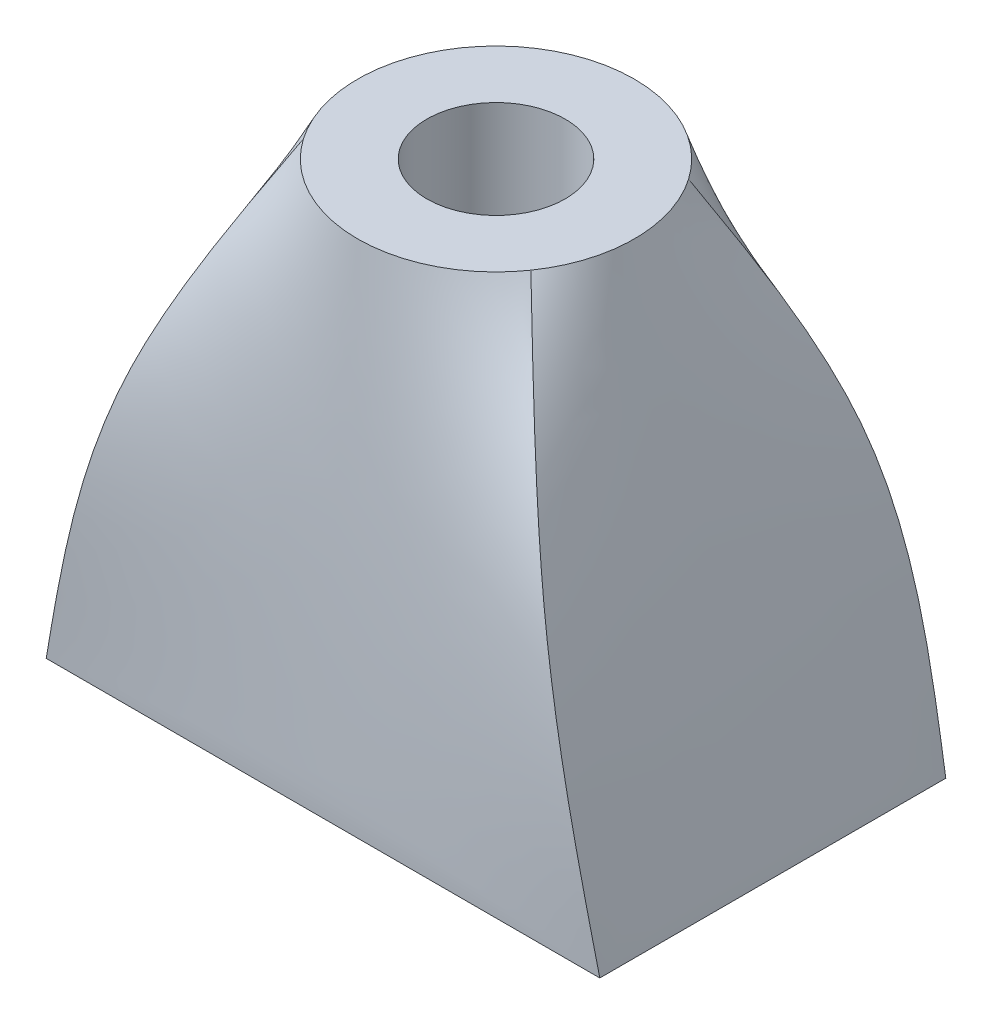
ISO-10303-21;
HEADER;
FILE_DESCRIPTION(('STEP AP214'),'2;1');
FILE_NAME('part.step','',(''),(''),'','','');
FILE_SCHEMA(('AUTOMOTIVE_DESIGN { 1 0 10303 214 1 1 1 1 }'));
ENDSEC;
DATA;
#1=APPLICATION_CONTEXT('core data for automotive mechanical design processes');
#2=APPLICATION_PROTOCOL_DEFINITION('international standard','automotive_design',2000,#1);
#3=PRODUCT_CONTEXT('',#1,'mechanical');
#4=PRODUCT('Part','Part','',(#3));
#5=PRODUCT_RELATED_PRODUCT_CATEGORY('part','',(#4));
#6=PRODUCT_DEFINITION_FORMATION('','',#4);
#7=PRODUCT_DEFINITION_CONTEXT('part definition',#1,'design');
#8=PRODUCT_DEFINITION('design','',#6,#7);
#9=PRODUCT_DEFINITION_SHAPE('','',#8);
#10=(LENGTH_UNIT() NAMED_UNIT(*) SI_UNIT(.MILLI.,.METRE.));
#11=(NAMED_UNIT(*) PLANE_ANGLE_UNIT() SI_UNIT($,.RADIAN.));
#12=(NAMED_UNIT(*) SI_UNIT($,.STERADIAN.) SOLID_ANGLE_UNIT());
#13=UNCERTAINTY_MEASURE_WITH_UNIT(LENGTH_MEASURE(1.E-05),#10,'distance_accuracy_value','');
#14=(GEOMETRIC_REPRESENTATION_CONTEXT(3) GLOBAL_UNCERTAINTY_ASSIGNED_CONTEXT((#13)) GLOBAL_UNIT_ASSIGNED_CONTEXT((#10,
#11,#12)) REPRESENTATION_CONTEXT('',''));
#15=CARTESIAN_POINT('',(0.,0.,0.));
#16=DIRECTION('',(0.,0.,1.));
#17=DIRECTION('',(1.,0.,0.));
#18=AXIS2_PLACEMENT_3D('',#15,#16,#17);
#19=CARTESIAN_POINT('',(0.,-14.142135623731,0.));
#20=DIRECTION('',(0.,1.,0.));
#21=DIRECTION('',(0.,0.,1.));
#22=AXIS2_PLACEMENT_3D('',#19,#20,#21);
#23=CYLINDRICAL_SURFACE('',#22,5.);
#24=CARTESIAN_POINT('',(0.,3.,0.));
#25=DIRECTION('',(0.,1.,0.));
#26=DIRECTION('',(0.,0.,1.));
#27=AXIS2_PLACEMENT_3D('',#24,#25,#26);
#28=CIRCLE('',#27,5.);
#29=CARTESIAN_POINT('',(0.,3.,5.));
#30=VERTEX_POINT('',#29);
#31=EDGE_CURVE('E302',#30,#30,#28,.F.);
#32=ORIENTED_EDGE('',*,*,#31,.T.);
#33=EDGE_LOOP('',(#32));
#34=FACE_BOUND('',#33,.T.);
#35=CARTESIAN_POINT('',(0.,19.,0.));
#36=DIRECTION('',(0.,1.,0.));
#37=DIRECTION('',(0.,0.,1.));
#38=AXIS2_PLACEMENT_3D('',#35,#36,#37);
#39=CIRCLE('',#38,5.);
#40=CARTESIAN_POINT('',(0.,19.,5.));
#41=VERTEX_POINT('',#40);
#42=EDGE_CURVE('E86',#41,#41,#39,.F.);
#43=ORIENTED_EDGE('',*,*,#42,.F.);
#44=EDGE_LOOP('',(#43));
#45=FACE_BOUND('',#44,.T.);
#46=ADVANCED_FACE('F81',(#34,#45),#23,.F.);
#47=CARTESIAN_POINT('',(0.,0.,0.));
#48=DIRECTION('',(0.,1.,0.));
#49=DIRECTION('',(0.,0.,1.));
#50=AXIS2_PLACEMENT_3D('',#47,#48,#49);
#51=PLANE('',#50);
#52=DIRECTION('',(0.,0.,-1.));
#53=VECTOR('',#52,1.);
#54=CARTESIAN_POINT('',(20.,0.,-12.5));
#55=LINE('',#54,#53);
#56=CARTESIAN_POINT('',(20.,0.,12.5));
#57=VERTEX_POINT('',#56);
#58=CARTESIAN_POINT('',(20.,0.,-12.5));
#59=VERTEX_POINT('',#58);
#60=EDGE_CURVE('E263',#57,#59,#55,.T.);
#61=ORIENTED_EDGE('',*,*,#60,.F.);
#62=DIRECTION('',(1.,0.,0.));
#63=VECTOR('',#62,1.);
#64=CARTESIAN_POINT('',(-20.,0.,12.5));
#65=LINE('',#64,#63);
#66=CARTESIAN_POINT('',(-20.,0.,12.5));
#67=VERTEX_POINT('',#66);
#68=EDGE_CURVE('E257',#67,#57,#65,.T.);
#69=ORIENTED_EDGE('',*,*,#68,.F.);
#70=DIRECTION('',(0.,0.,1.));
#71=VECTOR('',#70,1.);
#72=CARTESIAN_POINT('',(-20.,0.,-12.5));
#73=LINE('',#72,#71);
#74=CARTESIAN_POINT('',(-20.,0.,-12.5));
#75=VERTEX_POINT('',#74);
#76=EDGE_CURVE('E91',#75,#67,#73,.T.);
#77=ORIENTED_EDGE('',*,*,#76,.F.);
#78=DIRECTION('',(-1.,0.,0.));
#79=VECTOR('',#78,1.);
#80=CARTESIAN_POINT('',(-20.,0.,-12.5));
#81=LINE('',#80,#79);
#82=EDGE_CURVE('E13',#59,#75,#81,.T.);
#83=ORIENTED_EDGE('',*,*,#82,.F.);
#84=EDGE_LOOP('',(#61,#69,#77,#83));
#85=FACE_BOUND('',#84,.T.);
#86=DIRECTION('',(0.,0.,1.));
#87=VECTOR('',#86,1.);
#88=CARTESIAN_POINT('',(9.9,0.,4.9));
#89=LINE('',#88,#87);
#90=CARTESIAN_POINT('',(9.9,0.,-4.9));
#91=VERTEX_POINT('',#90);
#92=CARTESIAN_POINT('',(9.9,0.,4.9));
#93=VERTEX_POINT('',#92);
#94=EDGE_CURVE('E99',#91,#93,#89,.T.);
#95=ORIENTED_EDGE('',*,*,#94,.F.);
#96=DIRECTION('',(1.,0.,0.));
#97=VECTOR('',#96,1.);
#98=CARTESIAN_POINT('',(-9.9,0.,-4.9));
#99=LINE('',#98,#97);
#100=CARTESIAN_POINT('',(-9.9,0.,-4.9));
#101=VERTEX_POINT('',#100);
#102=EDGE_CURVE('E103',#101,#91,#99,.T.);
#103=ORIENTED_EDGE('',*,*,#102,.F.);
#104=DIRECTION('',(0.,0.,-1.));
#105=VECTOR('',#104,1.);
#106=CARTESIAN_POINT('',(-9.9,0.,4.9));
#107=LINE('',#106,#105);
#108=CARTESIAN_POINT('',(-9.9,0.,4.9));
#109=VERTEX_POINT('',#108);
#110=EDGE_CURVE('E312',#109,#101,#107,.T.);
#111=ORIENTED_EDGE('',*,*,#110,.F.);
#112=DIRECTION('',(-1.,0.,0.));
#113=VECTOR('',#112,1.);
#114=CARTESIAN_POINT('',(-9.9,0.,4.9));
#115=LINE('',#114,#113);
#116=EDGE_CURVE('E310',#93,#109,#115,.T.);
#117=ORIENTED_EDGE('',*,*,#116,.F.);
#118=EDGE_LOOP('',(#95,#103,#111,#117));
#119=FACE_BOUND('',#118,.T.);
#120=ADVANCED_FACE('F83',(#85,#119),#51,.F.);
#121=CARTESIAN_POINT('',(0.,35.,0.));
#122=DIRECTION('',(0.,1.,0.));
#123=DIRECTION('',(0.,0.,1.));
#124=AXIS2_PLACEMENT_3D('',#121,#122,#123);
#125=PLANE('',#124);
#126=CARTESIAN_POINT('',(0.,35.,0.));
#127=DIRECTION('',(0.,1.,0.));
#128=DIRECTION('',(0.,0.,1.));
#129=AXIS2_PLACEMENT_3D('',#126,#127,#128);
#130=CIRCLE('',#129,5.);
#131=CARTESIAN_POINT('',(0.,35.,5.));
#132=VERTEX_POINT('',#131);
#133=EDGE_CURVE('E295',#132,#132,#130,.T.);
#134=ORIENTED_EDGE('',*,*,#133,.F.);
#135=EDGE_LOOP('',(#134));
#136=FACE_BOUND('',#135,.T.);
#137=CARTESIAN_POINT('',(0.,35.,0.));
#138=DIRECTION('',(0.,1.,0.));
#139=DIRECTION('',(0.,0.,1.));
#140=AXIS2_PLACEMENT_3D('',#137,#138,#139);
#141=CIRCLE('',#140,10.);
#142=CARTESIAN_POINT('',(8.21738637043559,35.,5.69864556179618));
#143=VERTEX_POINT('',#142);
#144=CARTESIAN_POINT('',(8.21738637043559,35.,-5.69864556179618));
#145=VERTEX_POINT('',#144);
#146=EDGE_CURVE('E189',#143,#145,#141,.T.);
#147=ORIENTED_EDGE('',*,*,#146,.T.);
#148=CARTESIAN_POINT('',(-8.21738637043559,35.,-5.69864556179618));
#149=VERTEX_POINT('',#148);
#150=EDGE_CURVE('E193',#145,#149,#141,.T.);
#151=ORIENTED_EDGE('',*,*,#150,.T.);
#152=CARTESIAN_POINT('',(-8.2173863704356,35.,5.69864556179618));
#153=VERTEX_POINT('',#152);
#154=EDGE_CURVE('E172',#149,#153,#141,.T.);
#155=ORIENTED_EDGE('',*,*,#154,.T.);
#156=EDGE_CURVE('E169',#153,#143,#141,.T.);
#157=ORIENTED_EDGE('',*,*,#156,.T.);
#158=EDGE_LOOP('',(#147,#151,#155,#157));
#159=FACE_BOUND('',#158,.T.);
#160=ADVANCED_FACE('F205',(#136,#159),#125,.T.);
#161=CARTESIAN_POINT('',(-8.21738637043559,35.,-5.69864556179618));
#162=CARTESIAN_POINT('',(-10.6836548708764,30.0789336376883,-8.00347869681541));
#163=CARTESIAN_POINT('',(-16.2206158956905,19.0307640471616,-13.1780050044826));
#164=CARTESIAN_POINT('',(-18.6517433061727,6.78903078043243,-12.7418713632996));
#165=CARTESIAN_POINT('',(-20.,0.,-12.5));
#166=CARTESIAN_POINT('',(-7.75034082622212,35.,-6.37212027570395));
#167=CARTESIAN_POINT('',(-9.92234405449923,30.0789336376883,-8.40246541643361));
#168=CARTESIAN_POINT('',(-14.7986570831056,19.0307640471616,-12.9607452262482));
#169=CARTESIAN_POINT('',(-17.0723736681202,6.78903078043243,-12.6643661555145));
#170=CARTESIAN_POINT('',(-18.3333333333333,0.,-12.5));
#171=CARTESIAN_POINT('',(-6.66758671374989,35.,-7.5832642943872));
#172=CARTESIAN_POINT('',(-8.31164996547087,30.0789336376883,-9.1199836380098));
#173=CARTESIAN_POINT('',(-12.0026974509662,19.0307640471616,-12.5700358566533));
#174=CARTESIAN_POINT('',(-13.9307429164047,6.78903078043243,-12.5249845768344));
#175=CARTESIAN_POINT('',(-15.,0.,-12.5));
#176=CARTESIAN_POINT('',(-4.67850153963015,35.,-8.94371919099822));
#177=CARTESIAN_POINT('',(-5.67939907909928,30.0789336376883,-9.92595812402694));
#178=CARTESIAN_POINT('',(-7.92649045008441,19.0307640471616,-12.1311594994096));
#179=CARTESIAN_POINT('',(-9.26029663743338,6.78903078043244,-12.3684199170684));
#180=CARTESIAN_POINT('',(-10.,0.,-12.5));
#181=CARTESIAN_POINT('',(-2.43865268660446,35.0000000000001,-9.7990680521784));
#182=CARTESIAN_POINT('',(-2.89858823111377,30.0789336376883,-10.4326925703304));
#183=CARTESIAN_POINT('',(-3.93117863374819,19.0307640471616,-11.8552279758417));
#184=CARTESIAN_POINT('',(-4.61870888965441,6.78903078043242,-12.2699841631411));
#185=CARTESIAN_POINT('',(-5.00000000000001,0.,-12.5));
#186=CARTESIAN_POINT('',(0.,35.,-10.1004659739108));
#187=CARTESIAN_POINT('',(0.,30.0789336376883,-10.6112497835537));
#188=CARTESIAN_POINT('',(0.,19.0307640471616,-11.7579984224767));
#189=CARTESIAN_POINT('',(0.,6.78903078043243,-12.2352985126372));
#190=CARTESIAN_POINT('',(0.,0.,-12.5));
#191=CARTESIAN_POINT('',(2.43865268660446,35.0000000000001,-9.7990680521784));
#192=CARTESIAN_POINT('',(2.89858823111377,30.0789336376883,-10.4326925703304));
#193=CARTESIAN_POINT('',(3.93117863374819,19.0307640471616,-11.8552279758417));
#194=CARTESIAN_POINT('',(4.6187088896544,6.78903078043242,-12.2699841631411));
#195=CARTESIAN_POINT('',(5.,0.,-12.5));
#196=CARTESIAN_POINT('',(4.67850153963015,34.9999999999999,-8.94371919099822));
#197=CARTESIAN_POINT('',(5.67939907909928,30.0789336376883,-9.92595812402694));
#198=CARTESIAN_POINT('',(7.92649045008441,19.0307640471616,-12.1311594994096));
#199=CARTESIAN_POINT('',(9.26029663743337,6.78903078043244,-12.3684199170684));
#200=CARTESIAN_POINT('',(10.,0.,-12.5));
#201=CARTESIAN_POINT('',(6.66758671374988,35.0000000000001,-7.58326429438721));
#202=CARTESIAN_POINT('',(8.31164996547087,30.0789336376883,-9.11998363800981));
#203=CARTESIAN_POINT('',(12.0026974509662,19.0307640471616,-12.5700358566533));
#204=CARTESIAN_POINT('',(13.9307429164047,6.78903078043242,-12.5249845768344));
#205=CARTESIAN_POINT('',(15.,0.,-12.5));
#206=CARTESIAN_POINT('',(7.75034082622212,35.,-6.37212027570396));
#207=CARTESIAN_POINT('',(9.92234405449923,30.0789336376883,-8.40246541643361));
#208=CARTESIAN_POINT('',(14.7986570831056,19.0307640471616,-12.9607452262482));
#209=CARTESIAN_POINT('',(17.0723736681202,6.78903078043243,-12.6643661555145));
#210=CARTESIAN_POINT('',(18.3333333333333,0.,-12.5));
#211=CARTESIAN_POINT('',(8.21738637043559,35.,-5.69864556179618));
#212=CARTESIAN_POINT('',(10.6836548708764,30.0789336376883,-8.00347869681541));
#213=CARTESIAN_POINT('',(16.2206158956905,19.0307640471616,-13.1780050044826));
#214=CARTESIAN_POINT('',(18.6517433061727,6.78903078043243,-12.7418713632996));
#215=CARTESIAN_POINT('',(20.,0.,-12.5));
#216=B_SPLINE_SURFACE_WITH_KNOTS('',3,3,((#161,#162,#163,#164,#165),(#166,#167,#168,#169,#170),
(#171,#172,#173,#174,#175),(#176,#177,#178,#179,#180),(#181,#182,#183,#184,#185),(#186,#187,
#188,#189,#190),(#191,#192,#193,#194,#195),(#196,#197,#198,#199,#200),(#201,#202,#203,#204,
#205),(#206,#207,#208,#209,#210),(#211,#212,#213,#214,#215)),.UNSPECIFIED.,.F.,.F.,.F.,(4,1,1,1,
1,1,1,1,4),(4,1,4),(0.,0.125,0.25,0.375,0.5,0.625,0.75,0.875,1.),(0.,0.445419154909723,1.),.UNSPECIFIED.);
#217=CARTESIAN_POINT('',(8.21738637043559,35.,-5.69864556179618));
#218=CARTESIAN_POINT('',(10.6836548708764,30.0789336376883,-8.00347869681541));
#219=CARTESIAN_POINT('',(16.2206158956905,19.0307640471616,-13.1780050044826));
#220=CARTESIAN_POINT('',(18.6517433061727,6.78903078043243,-12.7418713632996));
#221=CARTESIAN_POINT('',(20.,0.,-12.5));
#222=B_SPLINE_CURVE_WITH_KNOTS('',3,(#217,#218,#219,#220,#221),.UNSPECIFIED.,.F.,.F.,(4,1,4),
(0.,0.445419154909723,1.),.UNSPECIFIED.);
#223=EDGE_CURVE('E355',#145,#59,#222,.T.);
#224=CARTESIAN_POINT('',(-8.21738637043559,35.,-5.69864556179618));
#225=CARTESIAN_POINT('',(-10.6836548708764,30.0789336376883,-8.00347869681541));
#226=CARTESIAN_POINT('',(-16.2206158956905,19.0307640471616,-13.1780050044826));
#227=CARTESIAN_POINT('',(-18.6517433061727,6.78903078043243,-12.7418713632996));
#228=CARTESIAN_POINT('',(-20.,0.,-12.5));
#229=B_SPLINE_CURVE_WITH_KNOTS('',3,(#224,#225,#226,#227,#228),.UNSPECIFIED.,.F.,.F.,(4,1,4),
(0.,0.445419154909723,1.),.UNSPECIFIED.);
#230=EDGE_CURVE('E350',#75,#149,#229,.F.);
#231=ORIENTED_EDGE('',*,*,#150,.F.);
#232=ORIENTED_EDGE('',*,*,#223,.T.);
#233=ORIENTED_EDGE('',*,*,#82,.T.);
#234=ORIENTED_EDGE('',*,*,#230,.T.);
#235=EDGE_LOOP('',(#231,#232,#233,#234));
#236=FACE_BOUND('',#235,.T.);
#237=ADVANCED_FACE('F215',(#236),#216,.T.);
#238=CARTESIAN_POINT('',(8.21738637043559,35.,-5.69864556179618));
#239=CARTESIAN_POINT('',(10.6836548708764,30.0789336376883,-8.00347869681541));
#240=CARTESIAN_POINT('',(16.2206158956905,19.0307640471616,-13.1780050044826));
#241=CARTESIAN_POINT('',(18.6517433061727,6.78903078043243,-12.7418713632996));
#242=CARTESIAN_POINT('',(20.,0.,-12.5));
#243=CARTESIAN_POINT('',(8.81144608958351,35.,-4.84201775674768));
#244=CARTESIAN_POINT('',(11.0355937539635,30.0789336376883,-6.7247483482833));
#245=CARTESIAN_POINT('',(16.0289750216164,19.0307640471616,-10.9516222282744));
#246=CARTESIAN_POINT('',(18.5833773808922,6.78903078043243,-10.607506601675));
#247=CARTESIAN_POINT('',(20.,0.,-10.4166666666667));
#248=CARTESIAN_POINT('',(9.70253566830539,35.0000000000001,-2.98904246377438));
#249=CARTESIAN_POINT('',(11.5635020785943,30.0789336376884,-4.0845134998134));
#250=CARTESIAN_POINT('',(15.7415137105054,19.0307640471616,-6.54392958904971));
#251=CARTESIAN_POINT('',(18.4808284929716,6.78903078043242,-6.35485638003777));
#252=CARTESIAN_POINT('',(20.,0.,-6.25));
#253=CARTESIAN_POINT('',(10.1480804576663,34.9999999999999,0.));
#254=CARTESIAN_POINT('',(11.8274562409096,30.0789336376882,0.));
#255=CARTESIAN_POINT('',(15.5977830549498,19.0307640471616,0.));
#256=CARTESIAN_POINT('',(18.4295540490113,6.78903078043244,0.));
#257=CARTESIAN_POINT('',(20.,0.,0.));
#258=CARTESIAN_POINT('',(9.70253566830539,35.0000000000001,2.98904246377438));
#259=CARTESIAN_POINT('',(11.5635020785943,30.0789336376883,4.0845134998134));
#260=CARTESIAN_POINT('',(15.7415137105054,19.0307640471616,6.54392958904972));
#261=CARTESIAN_POINT('',(18.4808284929716,6.78903078043242,6.35485638003778));
#262=CARTESIAN_POINT('',(20.,0.,6.25));
#263=CARTESIAN_POINT('',(8.81144608958351,35.,4.84201775674767));
#264=CARTESIAN_POINT('',(11.0355937539635,30.0789336376883,6.7247483482833));
#265=CARTESIAN_POINT('',(16.0289750216164,19.0307640471616,10.9516222282744));
#266=CARTESIAN_POINT('',(18.5833773808922,6.78903078043243,10.607506601675));
#267=CARTESIAN_POINT('',(20.,0.,10.4166666666667));
#268=CARTESIAN_POINT('',(8.21738637043559,35.,5.69864556179618));
#269=CARTESIAN_POINT('',(10.6836548708764,30.0789336376883,8.00347869681541));
#270=CARTESIAN_POINT('',(16.2206158956905,19.0307640471616,13.1780050044826));
#271=CARTESIAN_POINT('',(18.6517433061727,6.78903078043243,12.7418713632996));
#272=CARTESIAN_POINT('',(20.,0.,12.5));
#273=B_SPLINE_SURFACE_WITH_KNOTS('',3,3,((#238,#239,#240,#241,#242),(#243,#244,#245,#246,#247),
(#248,#249,#250,#251,#252),(#253,#254,#255,#256,#257),(#258,#259,#260,#261,#262),(#263,#264,
#265,#266,#267),(#268,#269,#270,#271,#272)),.UNSPECIFIED.,.F.,.F.,.F.,(4,1,1,1,4),(4,1,4),(0.,
0.25,0.5,0.75,1.),(0.,0.445419154909723,1.),.UNSPECIFIED.);
#274=CARTESIAN_POINT('',(8.21738637043559,35.,5.69864556179618));
#275=CARTESIAN_POINT('',(10.6836548708764,30.0789336376883,8.00347869681541));
#276=CARTESIAN_POINT('',(16.2206158956905,19.0307640471616,13.1780050044826));
#277=CARTESIAN_POINT('',(18.6517433061727,6.78903078043243,12.7418713632996));
#278=CARTESIAN_POINT('',(20.,0.,12.5));
#279=B_SPLINE_CURVE_WITH_KNOTS('',3,(#274,#275,#276,#277,#278),.UNSPECIFIED.,.F.,.F.,(4,1,4),
(0.,0.445419154909723,1.),.UNSPECIFIED.);
#280=EDGE_CURVE('E360',#143,#57,#279,.T.);
#281=ORIENTED_EDGE('',*,*,#146,.F.);
#282=ORIENTED_EDGE('',*,*,#280,.T.);
#283=ORIENTED_EDGE('',*,*,#60,.T.);
#284=ORIENTED_EDGE('',*,*,#223,.F.);
#285=EDGE_LOOP('',(#281,#282,#283,#284));
#286=FACE_BOUND('',#285,.T.);
#287=ADVANCED_FACE('F358',(#286),#273,.T.);
#288=CARTESIAN_POINT('',(-8.21738637043559,35.,5.69864556179618));
#289=CARTESIAN_POINT('',(-10.6836548708764,30.0789336376883,8.00347869681541));
#290=CARTESIAN_POINT('',(-16.2206158956905,19.0307640471616,13.1780050044826));
#291=CARTESIAN_POINT('',(-18.6517433061727,6.78903078043243,12.7418713632996));
#292=CARTESIAN_POINT('',(-20.,0.,12.5));
#293=CARTESIAN_POINT('',(-8.81144608958351,35.,4.84201775674767));
#294=CARTESIAN_POINT('',(-11.0355937539635,30.0789336376883,6.7247483482833));
#295=CARTESIAN_POINT('',(-16.0289750216164,19.0307640471616,10.9516222282744));
#296=CARTESIAN_POINT('',(-18.5833773808922,6.78903078043243,10.607506601675));
#297=CARTESIAN_POINT('',(-20.,0.,10.4166666666667));
#298=CARTESIAN_POINT('',(-9.70253566830538,35.0000000000001,2.98904246377438));
#299=CARTESIAN_POINT('',(-11.5635020785942,30.0789336376884,4.0845134998134));
#300=CARTESIAN_POINT('',(-15.7415137105054,19.0307640471616,6.54392958904972));
#301=CARTESIAN_POINT('',(-18.4808284929716,6.78903078043242,6.35485638003778));
#302=CARTESIAN_POINT('',(-20.,0.,6.25));
#303=CARTESIAN_POINT('',(-10.1480804576663,34.9999999999999,0.));
#304=CARTESIAN_POINT('',(-11.8274562409096,30.0789336376882,0.));
#305=CARTESIAN_POINT('',(-15.5977830549498,19.0307640471616,0.));
#306=CARTESIAN_POINT('',(-18.4295540490113,6.78903078043244,0.));
#307=CARTESIAN_POINT('',(-20.,0.,0.));
#308=CARTESIAN_POINT('',(-9.70253566830538,35.0000000000001,-2.98904246377438));
#309=CARTESIAN_POINT('',(-11.5635020785942,30.0789336376883,-4.08451349981339));
#310=CARTESIAN_POINT('',(-15.7415137105054,19.0307640471616,-6.54392958904971));
#311=CARTESIAN_POINT('',(-18.4808284929716,6.78903078043242,-6.35485638003778));
#312=CARTESIAN_POINT('',(-20.,0.,-6.25));
#313=CARTESIAN_POINT('',(-8.81144608958351,35.,-4.84201775674767));
#314=CARTESIAN_POINT('',(-11.0355937539635,30.0789336376883,-6.7247483482833));
#315=CARTESIAN_POINT('',(-16.0289750216164,19.0307640471616,-10.9516222282744));
#316=CARTESIAN_POINT('',(-18.5833773808922,6.78903078043243,-10.607506601675));
#317=CARTESIAN_POINT('',(-20.,0.,-10.4166666666667));
#318=CARTESIAN_POINT('',(-8.21738637043559,35.,-5.69864556179618));
#319=CARTESIAN_POINT('',(-10.6836548708764,30.0789336376883,-8.00347869681541));
#320=CARTESIAN_POINT('',(-16.2206158956905,19.0307640471616,-13.1780050044826));
#321=CARTESIAN_POINT('',(-18.6517433061727,6.78903078043243,-12.7418713632996));
#322=CARTESIAN_POINT('',(-20.,0.,-12.5));
#323=B_SPLINE_SURFACE_WITH_KNOTS('',3,3,((#288,#289,#290,#291,#292),(#293,#294,#295,#296,#297),
(#298,#299,#300,#301,#302),(#303,#304,#305,#306,#307),(#308,#309,#310,#311,#312),(#313,#314,
#315,#316,#317),(#318,#319,#320,#321,#322)),.UNSPECIFIED.,.F.,.F.,.F.,(4,1,1,1,4),(4,1,4),(0.,
0.25,0.5,0.75,1.),(0.,0.445419154909723,1.),.UNSPECIFIED.);
#324=CARTESIAN_POINT('',(-8.2173863704356,35.,5.69864556179618));
#325=CARTESIAN_POINT('',(-10.6836548708764,30.0789336376883,8.00347869681541));
#326=CARTESIAN_POINT('',(-16.2206158956905,19.0307640471616,13.1780050044826));
#327=CARTESIAN_POINT('',(-18.6517433061727,6.78903078043243,12.7418713632996));
#328=CARTESIAN_POINT('',(-20.,0.,12.5));
#329=B_SPLINE_CURVE_WITH_KNOTS('',3,(#324,#325,#326,#327,#328),.UNSPECIFIED.,.F.,.F.,(4,1,4),
(0.,0.445419154909723,1.),.UNSPECIFIED.);
#330=EDGE_CURVE('E362',#153,#67,#329,.T.);
#331=ORIENTED_EDGE('',*,*,#154,.F.);
#332=ORIENTED_EDGE('',*,*,#230,.F.);
#333=ORIENTED_EDGE('',*,*,#76,.T.);
#334=ORIENTED_EDGE('',*,*,#330,.F.);
#335=EDGE_LOOP('',(#331,#332,#333,#334));
#336=FACE_BOUND('',#335,.T.);
#337=ADVANCED_FACE('F400',(#336),#323,.T.);
#338=CARTESIAN_POINT('',(8.21738637043559,35.,5.69864556179618));
#339=CARTESIAN_POINT('',(10.6836548708764,30.0789336376883,8.00347869681541));
#340=CARTESIAN_POINT('',(16.2206158956905,19.0307640471616,13.1780050044826));
#341=CARTESIAN_POINT('',(18.6517433061727,6.78903078043243,12.7418713632996));
#342=CARTESIAN_POINT('',(20.,0.,12.5));
#343=CARTESIAN_POINT('',(7.75034082622212,35.,6.37212027570395));
#344=CARTESIAN_POINT('',(9.92234405449924,30.0789336376883,8.40246541643361));
#345=CARTESIAN_POINT('',(14.7986570831056,19.0307640471616,12.9607452262482));
#346=CARTESIAN_POINT('',(17.0723736681202,6.78903078043243,12.6643661555145));
#347=CARTESIAN_POINT('',(18.3333333333333,0.,12.5));
#348=CARTESIAN_POINT('',(6.66758671374989,35.,7.58326429438721));
#349=CARTESIAN_POINT('',(8.31164996547087,30.0789336376883,9.11998363800981));
#350=CARTESIAN_POINT('',(12.0026974509662,19.0307640471616,12.5700358566533));
#351=CARTESIAN_POINT('',(13.9307429164047,6.78903078043243,12.5249845768344));
#352=CARTESIAN_POINT('',(15.,0.,12.5));
#353=CARTESIAN_POINT('',(4.67850153963015,35.,8.94371919099822));
#354=CARTESIAN_POINT('',(5.67939907909928,30.0789336376883,9.92595812402694));
#355=CARTESIAN_POINT('',(7.92649045008441,19.0307640471616,12.1311594994096));
#356=CARTESIAN_POINT('',(9.26029663743338,6.78903078043243,12.3684199170684));
#357=CARTESIAN_POINT('',(10.,0.,12.5));
#358=CARTESIAN_POINT('',(2.43865268660446,35.,9.7990680521784));
#359=CARTESIAN_POINT('',(2.89858823111377,30.0789336376883,10.4326925703304));
#360=CARTESIAN_POINT('',(3.9311786337482,19.0307640471616,11.8552279758417));
#361=CARTESIAN_POINT('',(4.61870888965441,6.78903078043243,12.2699841631411));
#362=CARTESIAN_POINT('',(5.00000000000001,0.,12.5));
#363=CARTESIAN_POINT('',(0.,35.,10.1004659739108));
#364=CARTESIAN_POINT('',(0.,30.0789336376883,10.6112497835538));
#365=CARTESIAN_POINT('',(0.,19.0307640471616,11.7579984224767));
#366=CARTESIAN_POINT('',(0.,6.78903078043243,12.2352985126372));
#367=CARTESIAN_POINT('',(0.,0.,12.5));
#368=CARTESIAN_POINT('',(-2.43865268660446,35.,9.7990680521784));
#369=CARTESIAN_POINT('',(-2.89858823111377,30.0789336376883,10.4326925703304));
#370=CARTESIAN_POINT('',(-3.93117863374819,19.0307640471616,11.8552279758417));
#371=CARTESIAN_POINT('',(-4.6187088896544,6.78903078043242,12.2699841631411));
#372=CARTESIAN_POINT('',(-5.,0.,12.5));
#373=CARTESIAN_POINT('',(-4.67850153963015,34.9999999999999,8.94371919099822));
#374=CARTESIAN_POINT('',(-5.67939907909928,30.0789336376883,9.92595812402694));
#375=CARTESIAN_POINT('',(-7.92649045008441,19.0307640471616,12.1311594994096));
#376=CARTESIAN_POINT('',(-9.26029663743337,6.78903078043244,12.3684199170684));
#377=CARTESIAN_POINT('',(-10.,0.,12.5));
#378=CARTESIAN_POINT('',(-6.66758671374989,35.0000000000001,7.5832642943872));
#379=CARTESIAN_POINT('',(-8.31164996547087,30.0789336376883,9.1199836380098));
#380=CARTESIAN_POINT('',(-12.0026974509662,19.0307640471616,12.5700358566533));
#381=CARTESIAN_POINT('',(-13.9307429164047,6.78903078043242,12.5249845768344));
#382=CARTESIAN_POINT('',(-15.,0.,12.5));
#383=CARTESIAN_POINT('',(-7.75034082622212,35.,6.37212027570395));
#384=CARTESIAN_POINT('',(-9.92234405449923,30.0789336376883,8.40246541643361));
#385=CARTESIAN_POINT('',(-14.7986570831056,19.0307640471616,12.9607452262482));
#386=CARTESIAN_POINT('',(-17.0723736681202,6.78903078043243,12.6643661555145));
#387=CARTESIAN_POINT('',(-18.3333333333333,0.,12.5));
#388=CARTESIAN_POINT('',(-8.2173863704356,35.,5.69864556179618));
#389=CARTESIAN_POINT('',(-10.6836548708764,30.0789336376883,8.00347869681541));
#390=CARTESIAN_POINT('',(-16.2206158956905,19.0307640471616,13.1780050044826));
#391=CARTESIAN_POINT('',(-18.6517433061727,6.78903078043243,12.7418713632996));
#392=CARTESIAN_POINT('',(-20.,0.,12.5));
#393=B_SPLINE_SURFACE_WITH_KNOTS('',3,3,((#338,#339,#340,#341,#342),(#343,#344,#345,#346,#347),
(#348,#349,#350,#351,#352),(#353,#354,#355,#356,#357),(#358,#359,#360,#361,#362),(#363,#364,
#365,#366,#367),(#368,#369,#370,#371,#372),(#373,#374,#375,#376,#377),(#378,#379,#380,#381,
#382),(#383,#384,#385,#386,#387),(#388,#389,#390,#391,#392)),.UNSPECIFIED.,.F.,.F.,.F.,(4,1,1,1,
1,1,1,1,4),(4,1,4),(0.,0.125,0.25,0.375,0.5,0.625,0.75,0.875,1.),(0.,0.445419154909723,1.),.UNSPECIFIED.);
#394=ORIENTED_EDGE('',*,*,#156,.F.);
#395=ORIENTED_EDGE('',*,*,#330,.T.);
#396=ORIENTED_EDGE('',*,*,#68,.T.);
#397=ORIENTED_EDGE('',*,*,#280,.F.);
#398=EDGE_LOOP('',(#394,#395,#396,#397));
#399=FACE_BOUND('',#398,.T.);
#400=ADVANCED_FACE('F448',(#399),#393,.T.);
#401=CARTESIAN_POINT('',(9.9,-5.,4.9));
#402=DIRECTION('',(-1.,0.,0.));
#403=DIRECTION('',(0.,0.,1.));
#404=AXIS2_PLACEMENT_3D('',#401,#402,#403);
#405=PLANE('',#404);
#406=ORIENTED_EDGE('',*,*,#94,.T.);
#407=DIRECTION('',(0.,1.,0.));
#408=VECTOR('',#407,1.);
#409=CARTESIAN_POINT('',(9.9,-5.,4.9));
#410=LINE('',#409,#408);
#411=CARTESIAN_POINT('',(9.9,-5.,4.9));
#412=VERTEX_POINT('',#411);
#413=EDGE_CURVE('E152',#412,#93,#410,.T.);
#414=ORIENTED_EDGE('',*,*,#413,.F.);
#415=DIRECTION('',(0.,0.,1.));
#416=VECTOR('',#415,1.);
#417=CARTESIAN_POINT('',(9.9,-5.,4.9));
#418=LINE('',#417,#416);
#419=CARTESIAN_POINT('',(9.9,-5.,-4.9));
#420=VERTEX_POINT('',#419);
#421=EDGE_CURVE('E158',#420,#412,#418,.T.);
#422=ORIENTED_EDGE('',*,*,#421,.F.);
#423=DIRECTION('',(0.,1.,0.));
#424=VECTOR('',#423,1.);
#425=CARTESIAN_POINT('',(9.9,-5.,-4.9));
#426=LINE('',#425,#424);
#427=EDGE_CURVE('E308',#420,#91,#426,.T.);
#428=ORIENTED_EDGE('',*,*,#427,.T.);
#429=EDGE_LOOP('',(#406,#414,#422,#428));
#430=FACE_BOUND('',#429,.T.);
#431=ADVANCED_FACE('F168',(#430),#405,.F.);
#432=CARTESIAN_POINT('',(-9.9,-5.,4.9));
#433=DIRECTION('',(0.,0.,-1.));
#434=DIRECTION('',(-1.,0.,0.));
#435=AXIS2_PLACEMENT_3D('',#432,#433,#434);
#436=PLANE('',#435);
#437=ORIENTED_EDGE('',*,*,#116,.T.);
#438=DIRECTION('',(0.,1.,0.));
#439=VECTOR('',#438,1.);
#440=CARTESIAN_POINT('',(-9.9,-5.,4.9));
#441=LINE('',#440,#439);
#442=CARTESIAN_POINT('',(-9.9,-5.,4.9));
#443=VERTEX_POINT('',#442);
#444=EDGE_CURVE('E154',#443,#109,#441,.T.);
#445=ORIENTED_EDGE('',*,*,#444,.F.);
#446=DIRECTION('',(-1.,0.,0.));
#447=VECTOR('',#446,1.);
#448=CARTESIAN_POINT('',(-9.9,-5.,4.9));
#449=LINE('',#448,#447);
#450=EDGE_CURVE('E147',#412,#443,#449,.T.);
#451=ORIENTED_EDGE('',*,*,#450,.F.);
#452=ORIENTED_EDGE('',*,*,#413,.T.);
#453=EDGE_LOOP('',(#437,#445,#451,#452));
#454=FACE_BOUND('',#453,.T.);
#455=ADVANCED_FACE('F150',(#454),#436,.F.);
#456=CARTESIAN_POINT('',(-9.9,-5.,4.9));
#457=DIRECTION('',(1.,0.,0.));
#458=DIRECTION('',(0.,0.,-1.));
#459=AXIS2_PLACEMENT_3D('',#456,#457,#458);
#460=PLANE('',#459);
#461=ORIENTED_EDGE('',*,*,#110,.T.);
#462=DIRECTION('',(0.,1.,0.));
#463=VECTOR('',#462,1.);
#464=CARTESIAN_POINT('',(-9.9,-5.,-4.9));
#465=LINE('',#464,#463);
#466=CARTESIAN_POINT('',(-9.9,-5.,-4.9));
#467=VERTEX_POINT('',#466);
#468=EDGE_CURVE('E174',#467,#101,#465,.T.);
#469=ORIENTED_EDGE('',*,*,#468,.F.);
#470=DIRECTION('',(0.,0.,-1.));
#471=VECTOR('',#470,1.);
#472=CARTESIAN_POINT('',(-9.9,-5.,4.9));
#473=LINE('',#472,#471);
#474=EDGE_CURVE('E157',#443,#467,#473,.T.);
#475=ORIENTED_EDGE('',*,*,#474,.F.);
#476=ORIENTED_EDGE('',*,*,#444,.T.);
#477=EDGE_LOOP('',(#461,#469,#475,#476));
#478=FACE_BOUND('',#477,.T.);
#479=ADVANCED_FACE('F320',(#478),#460,.F.);
#480=CARTESIAN_POINT('',(-9.9,-5.,-4.9));
#481=DIRECTION('',(0.,0.,1.));
#482=DIRECTION('',(1.,0.,0.));
#483=AXIS2_PLACEMENT_3D('',#480,#481,#482);
#484=PLANE('',#483);
#485=ORIENTED_EDGE('',*,*,#102,.T.);
#486=ORIENTED_EDGE('',*,*,#427,.F.);
#487=DIRECTION('',(1.,0.,0.));
#488=VECTOR('',#487,1.);
#489=CARTESIAN_POINT('',(-9.9,-5.,-4.9));
#490=LINE('',#489,#488);
#491=EDGE_CURVE('E163',#467,#420,#490,.T.);
#492=ORIENTED_EDGE('',*,*,#491,.F.);
#493=ORIENTED_EDGE('',*,*,#468,.T.);
#494=EDGE_LOOP('',(#485,#486,#492,#493));
#495=FACE_BOUND('',#494,.T.);
#496=ADVANCED_FACE('F318',(#495),#484,.F.);
#497=CARTESIAN_POINT('',(0.,-5.,0.));
#498=DIRECTION('',(0.,-1.,0.));
#499=DIRECTION('',(0.,0.,-1.));
#500=AXIS2_PLACEMENT_3D('',#497,#498,#499);
#501=PLANE('',#500);
#502=CARTESIAN_POINT('',(0.,-5.,0.));
#503=DIRECTION('',(0.,-1.,0.));
#504=DIRECTION('',(0.,0.,-1.));
#505=AXIS2_PLACEMENT_3D('',#502,#503,#504);
#506=CIRCLE('',#505,1.6);
#507=CARTESIAN_POINT('',(0.,-5.,-1.6));
#508=VERTEX_POINT('',#507);
#509=EDGE_CURVE('E291',#508,#508,#506,.T.);
#510=ORIENTED_EDGE('',*,*,#509,.F.);
#511=EDGE_LOOP('',(#510));
#512=FACE_BOUND('',#511,.T.);
#513=ORIENTED_EDGE('',*,*,#421,.T.);
#514=ORIENTED_EDGE('',*,*,#450,.T.);
#515=ORIENTED_EDGE('',*,*,#474,.T.);
#516=ORIENTED_EDGE('',*,*,#491,.T.);
#517=EDGE_LOOP('',(#513,#514,#515,#516));
#518=FACE_BOUND('',#517,.T.);
#519=ADVANCED_FACE('F161',(#512,#518),#501,.T.);
#520=CARTESIAN_POINT('',(0.,27.,0.));
#521=DIRECTION('',(0.,1.,0.));
#522=DIRECTION('',(0.,0.,1.));
#523=AXIS2_PLACEMENT_3D('',#520,#521,#522);
#524=CIRCLE('',#523,5.);
#525=CARTESIAN_POINT('',(0.,27.,5.));
#526=VERTEX_POINT('',#525);
#527=EDGE_CURVE('E271',#526,#526,#524,.F.);
#528=ORIENTED_EDGE('',*,*,#527,.T.);
#529=EDGE_LOOP('',(#528));
#530=FACE_BOUND('',#529,.T.);
#531=ORIENTED_EDGE('',*,*,#133,.T.);
#532=EDGE_LOOP('',(#531));
#533=FACE_BOUND('',#532,.T.);
#534=ADVANCED_FACE('F327',(#530,#533),#23,.F.);
#535=CARTESIAN_POINT('',(0.,3.,0.));
#536=DIRECTION('',(0.,1.,0.));
#537=DIRECTION('',(0.,0.,1.));
#538=AXIS2_PLACEMENT_3D('',#535,#536,#537);
#539=PLANE('',#538);
#540=CARTESIAN_POINT('',(0.,3.,0.));
#541=DIRECTION('',(0.,1.,0.));
#542=DIRECTION('',(0.,0.,1.));
#543=AXIS2_PLACEMENT_3D('',#540,#541,#542);
#544=CIRCLE('',#543,1.6);
#545=CARTESIAN_POINT('',(0.,3.,1.6));
#546=VERTEX_POINT('',#545);
#547=EDGE_CURVE('E282',#546,#546,#544,.F.);
#548=ORIENTED_EDGE('',*,*,#547,.T.);
#549=EDGE_LOOP('',(#548));
#550=FACE_BOUND('',#549,.T.);
#551=ORIENTED_EDGE('',*,*,#31,.F.);
#552=EDGE_LOOP('',(#551));
#553=FACE_BOUND('',#552,.T.);
#554=ADVANCED_FACE('F334',(#550,#553),#539,.T.);
#555=CARTESIAN_POINT('',(0.,35.0083148281188,0.));
#556=DIRECTION('',(0.,-1.,0.));
#557=DIRECTION('',(0.,0.,-1.));
#558=AXIS2_PLACEMENT_3D('',#555,#556,#557);
#559=CYLINDRICAL_SURFACE('',#558,1.6);
#560=ORIENTED_EDGE('',*,*,#547,.F.);
#561=EDGE_LOOP('',(#560));
#562=FACE_BOUND('',#561,.T.);
#563=ORIENTED_EDGE('',*,*,#509,.T.);
#564=EDGE_LOOP('',(#563));
#565=FACE_BOUND('',#564,.T.);
#566=ADVANCED_FACE('F339',(#562,#565),#559,.F.);
#567=CARTESIAN_POINT('',(0.,19.,0.));
#568=DIRECTION('',(0.,1.,0.));
#569=DIRECTION('',(0.,0.,1.));
#570=AXIS2_PLACEMENT_3D('',#567,#568,#569);
#571=PLANE('',#570);
#572=CARTESIAN_POINT('',(0.,19.,0.));
#573=DIRECTION('',(0.,1.,0.));
#574=DIRECTION('',(0.,0.,1.));
#575=AXIS2_PLACEMENT_3D('',#572,#573,#574);
#576=CIRCLE('',#575,7.5);
#577=CARTESIAN_POINT('',(0.,19.,7.5));
#578=VERTEX_POINT('',#577);
#579=EDGE_CURVE('E278',#578,#578,#576,.T.);
#580=ORIENTED_EDGE('',*,*,#579,.T.);
#581=EDGE_LOOP('',(#580));
#582=FACE_BOUND('',#581,.T.);
#583=ORIENTED_EDGE('',*,*,#42,.T.);
#584=EDGE_LOOP('',(#583));
#585=FACE_BOUND('',#584,.T.);
#586=ADVANCED_FACE('F594',(#582,#585),#571,.T.);
#587=CARTESIAN_POINT('',(0.,27.,0.));
#588=DIRECTION('',(0.,1.,0.));
#589=DIRECTION('',(0.,0.,1.));
#590=AXIS2_PLACEMENT_3D('',#587,#588,#589);
#591=PLANE('',#590);
#592=CARTESIAN_POINT('',(0.,27.,0.));
#593=DIRECTION('',(0.,1.,0.));
#594=DIRECTION('',(0.,0.,1.));
#595=AXIS2_PLACEMENT_3D('',#592,#593,#594);
#596=CIRCLE('',#595,7.5);
#597=CARTESIAN_POINT('',(0.,27.,7.5));
#598=VERTEX_POINT('',#597);
#599=EDGE_CURVE('E284',#598,#598,#596,.T.);
#600=ORIENTED_EDGE('',*,*,#599,.F.);
#601=EDGE_LOOP('',(#600));
#602=FACE_BOUND('',#601,.T.);
#603=ORIENTED_EDGE('',*,*,#527,.F.);
#604=EDGE_LOOP('',(#603));
#605=FACE_BOUND('',#604,.T.);
#606=ADVANCED_FACE('F608',(#602,#605),#591,.F.);
#607=CARTESIAN_POINT('',(0.,19.,0.));
#608=DIRECTION('',(0.,1.,0.));
#609=DIRECTION('',(0.,0.,1.));
#610=AXIS2_PLACEMENT_3D('',#607,#608,#609);
#611=CYLINDRICAL_SURFACE('',#610,7.5);
#612=ORIENTED_EDGE('',*,*,#579,.F.);
#613=EDGE_LOOP('',(#612));
#614=FACE_BOUND('',#613,.T.);
#615=ORIENTED_EDGE('',*,*,#599,.T.);
#616=EDGE_LOOP('',(#615));
#617=FACE_BOUND('',#616,.T.);
#618=ADVANCED_FACE('F617',(#614,#617),#611,.F.);
#619=CLOSED_SHELL('',(#46,#120,#160,#237,#287,#337,#400,#431,#455,#479,#496,#519,#534,#554,#566,
#586,#606,#618));
#620=MANIFOLD_SOLID_BREP('B2',#619);
#621=ADVANCED_BREP_SHAPE_REPRESENTATION('',(#18,#620),#14);
#622=SHAPE_DEFINITION_REPRESENTATION(#9,#621);
ENDSEC;
END-ISO-10303-21;
